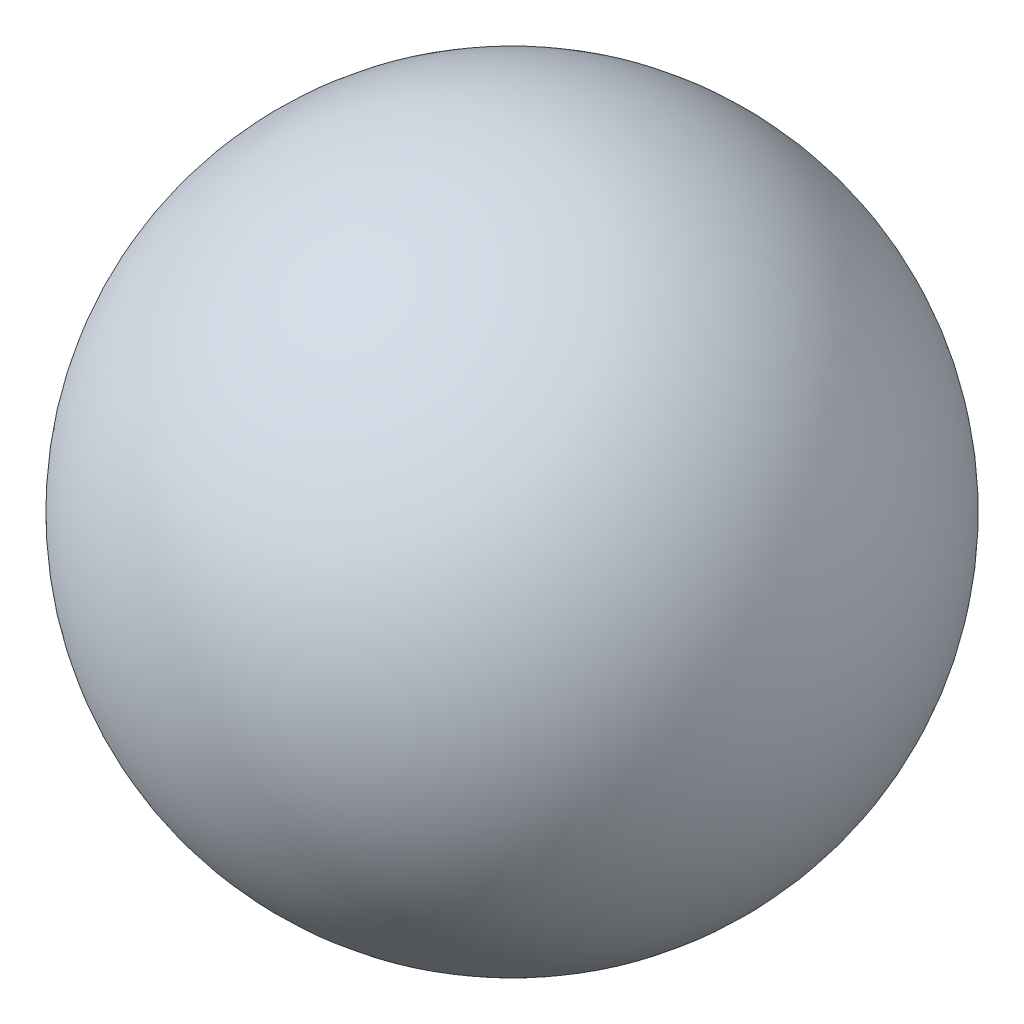
ISO-10303-21;
HEADER;
FILE_DESCRIPTION(('STEP AP214'),'2;1');
FILE_NAME('part.step','',(''),(''),'','','');
FILE_SCHEMA(('AUTOMOTIVE_DESIGN { 1 0 10303 214 1 1 1 1 }'));
ENDSEC;
DATA;
#1=APPLICATION_CONTEXT('core data for automotive mechanical design processes');
#2=APPLICATION_PROTOCOL_DEFINITION('international standard','automotive_design',2000,#1);
#3=PRODUCT_CONTEXT('',#1,'mechanical');
#4=PRODUCT('Part','Part','',(#3));
#5=PRODUCT_RELATED_PRODUCT_CATEGORY('part','',(#4));
#6=PRODUCT_DEFINITION_FORMATION('','',#4);
#7=PRODUCT_DEFINITION_CONTEXT('part definition',#1,'design');
#8=PRODUCT_DEFINITION('design','',#6,#7);
#9=PRODUCT_DEFINITION_SHAPE('','',#8);
#10=(LENGTH_UNIT() NAMED_UNIT(*) SI_UNIT(.MILLI.,.METRE.));
#11=(NAMED_UNIT(*) PLANE_ANGLE_UNIT() SI_UNIT($,.RADIAN.));
#12=(NAMED_UNIT(*) SI_UNIT($,.STERADIAN.) SOLID_ANGLE_UNIT());
#13=UNCERTAINTY_MEASURE_WITH_UNIT(LENGTH_MEASURE(1.E-05),#10,'distance_accuracy_value','');
#14=(GEOMETRIC_REPRESENTATION_CONTEXT(3) GLOBAL_UNCERTAINTY_ASSIGNED_CONTEXT((#13)) GLOBAL_UNIT_ASSIGNED_CONTEXT((#10,
#11,#12)) REPRESENTATION_CONTEXT('',''));
#15=CARTESIAN_POINT('',(0.,0.,0.));
#16=DIRECTION('',(0.,0.,1.));
#17=DIRECTION('',(1.,0.,0.));
#18=AXIS2_PLACEMENT_3D('',#15,#16,#17);
#19=CARTESIAN_POINT('',(0.,0.,0.));
#20=DIRECTION('',(0.,1.,0.));
#21=DIRECTION('',(1.,0.,0.));
#22=AXIS2_PLACEMENT_3D('',#19,#20,#21);
#23=SPHERICAL_SURFACE('',#22,4.);
#24=CARTESIAN_POINT('',(0.,4.,0.));
#25=VERTEX_POINT('',#24);
#26=VERTEX_LOOP('',#25);
#27=FACE_BOUND('',#26,.T.);
#28=ADVANCED_FACE('F28',(#27),#23,.T.);
#29=CLOSED_SHELL('',(#28));
#30=MANIFOLD_SOLID_BREP('B2',#29);
#31=ADVANCED_BREP_SHAPE_REPRESENTATION('',(#18,#30),#14);
#32=SHAPE_DEFINITION_REPRESENTATION(#9,#31);
ENDSEC;
END-ISO-10303-21;
